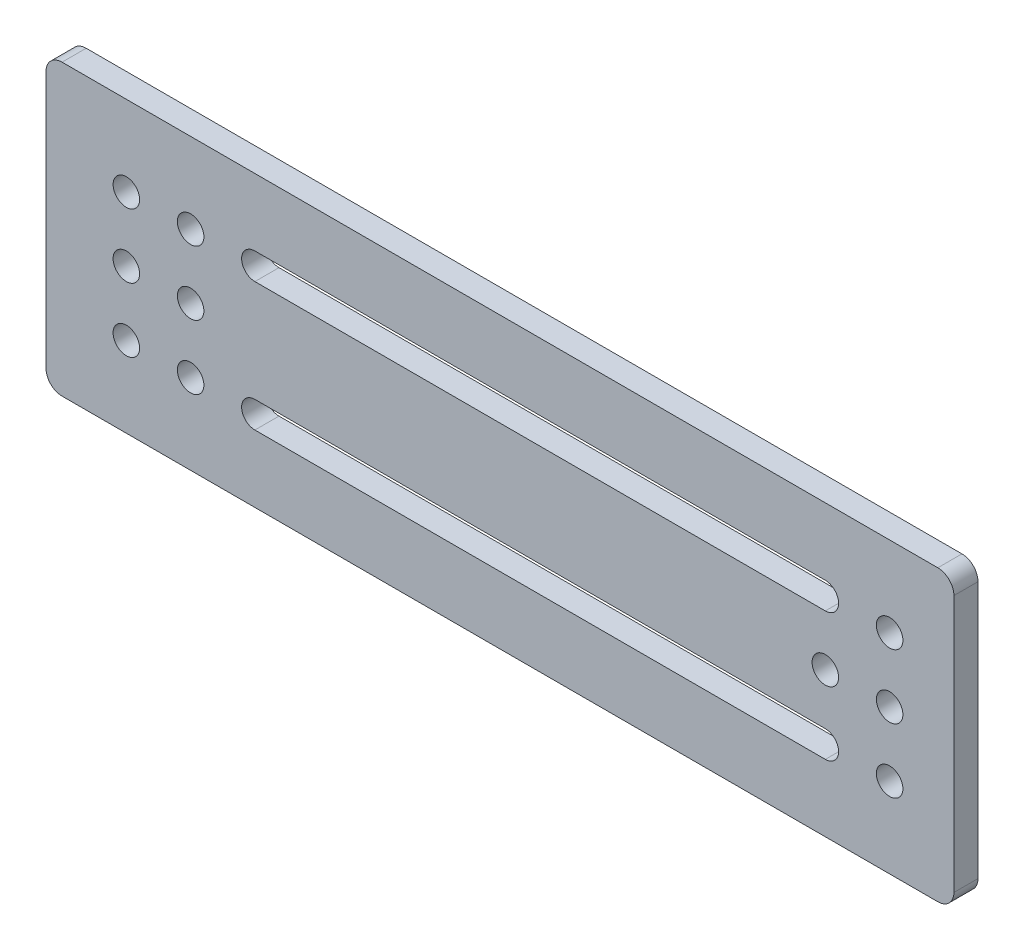
ISO-10303-21;
HEADER;
FILE_DESCRIPTION(('STEP AP214'),'2;1');
FILE_NAME('part.step','',(''),(''),'','','');
FILE_SCHEMA(('AUTOMOTIVE_DESIGN { 1 0 10303 214 1 1 1 1 }'));
ENDSEC;
DATA;
#1=APPLICATION_CONTEXT('core data for automotive mechanical design processes');
#2=APPLICATION_PROTOCOL_DEFINITION('international standard','automotive_design',2000,#1);
#3=PRODUCT_CONTEXT('',#1,'mechanical');
#4=PRODUCT('Part','Part','',(#3));
#5=PRODUCT_RELATED_PRODUCT_CATEGORY('part','',(#4));
#6=PRODUCT_DEFINITION_FORMATION('','',#4);
#7=PRODUCT_DEFINITION_CONTEXT('part definition',#1,'design');
#8=PRODUCT_DEFINITION('design','',#6,#7);
#9=PRODUCT_DEFINITION_SHAPE('','',#8);
#10=(LENGTH_UNIT() NAMED_UNIT(*) SI_UNIT(.MILLI.,.METRE.));
#11=(NAMED_UNIT(*) PLANE_ANGLE_UNIT() SI_UNIT($,.RADIAN.));
#12=(NAMED_UNIT(*) SI_UNIT($,.STERADIAN.) SOLID_ANGLE_UNIT());
#13=UNCERTAINTY_MEASURE_WITH_UNIT(LENGTH_MEASURE(1.E-05),#10,'distance_accuracy_value','');
#14=(GEOMETRIC_REPRESENTATION_CONTEXT(3) GLOBAL_UNCERTAINTY_ASSIGNED_CONTEXT((#13)) GLOBAL_UNIT_ASSIGNED_CONTEXT((#10,
#11,#12)) REPRESENTATION_CONTEXT('',''));
#15=CARTESIAN_POINT('',(0.,0.,0.));
#16=DIRECTION('',(0.,0.,1.));
#17=DIRECTION('',(1.,0.,0.));
#18=AXIS2_PLACEMENT_3D('',#15,#16,#17);
#19=CARTESIAN_POINT('',(0.,0.,3.));
#20=DIRECTION('',(0.,1.,0.));
#21=DIRECTION('',(0.,0.,1.));
#22=AXIS2_PLACEMENT_3D('',#19,#20,#21);
#23=PLANE('',#22);
#24=DIRECTION('',(1.,0.,0.));
#25=VECTOR('',#24,1.);
#26=CARTESIAN_POINT('',(0.,0.,3.));
#27=LINE('',#26,#25);
#28=CARTESIAN_POINT('',(2.,0.,3.));
#29=VERTEX_POINT('',#28);
#30=CARTESIAN_POINT('',(111.,0.,3.));
#31=VERTEX_POINT('',#30);
#32=EDGE_CURVE('E203',#29,#31,#27,.T.);
#33=ORIENTED_EDGE('',*,*,#32,.F.);
#34=DIRECTION('',(0.,0.,-1.));
#35=VECTOR('',#34,1.);
#36=CARTESIAN_POINT('',(2.,0.,0.));
#37=LINE('',#36,#35);
#38=CARTESIAN_POINT('',(2.,0.,0.));
#39=VERTEX_POINT('',#38);
#40=EDGE_CURVE('E309',#29,#39,#37,.T.);
#41=ORIENTED_EDGE('',*,*,#40,.T.);
#42=DIRECTION('',(1.,0.,0.));
#43=VECTOR('',#42,1.);
#44=CARTESIAN_POINT('',(0.,0.,0.));
#45=LINE('',#44,#43);
#46=CARTESIAN_POINT('',(111.,0.,0.));
#47=VERTEX_POINT('',#46);
#48=EDGE_CURVE('E264',#39,#47,#45,.T.);
#49=ORIENTED_EDGE('',*,*,#48,.T.);
#50=DIRECTION('',(0.,0.,-1.));
#51=VECTOR('',#50,1.);
#52=CARTESIAN_POINT('',(111.,0.,3.));
#53=LINE('',#52,#51);
#54=EDGE_CURVE('E302',#47,#31,#53,.F.);
#55=ORIENTED_EDGE('',*,*,#54,.T.);
#56=EDGE_LOOP('',(#33,#41,#49,#55));
#57=FACE_BOUND('',#56,.T.);
#58=ADVANCED_FACE('F36',(#57),#23,.F.);
#59=CARTESIAN_POINT('',(113.,0.,3.));
#60=DIRECTION('',(-1.,0.,0.));
#61=DIRECTION('',(0.,0.,1.));
#62=AXIS2_PLACEMENT_3D('',#59,#60,#61);
#63=PLANE('',#62);
#64=DIRECTION('',(0.,1.,0.));
#65=VECTOR('',#64,1.);
#66=CARTESIAN_POINT('',(113.,0.,3.));
#67=LINE('',#66,#65);
#68=CARTESIAN_POINT('',(113.,2.,3.));
#69=VERTEX_POINT('',#68);
#70=CARTESIAN_POINT('',(113.,34.,3.));
#71=VERTEX_POINT('',#70);
#72=EDGE_CURVE('E206',#69,#71,#67,.T.);
#73=ORIENTED_EDGE('',*,*,#72,.F.);
#74=DIRECTION('',(0.,0.,-1.));
#75=VECTOR('',#74,1.);
#76=CARTESIAN_POINT('',(113.,2.,3.));
#77=LINE('',#76,#75);
#78=CARTESIAN_POINT('',(113.,2.,0.));
#79=VERTEX_POINT('',#78);
#80=EDGE_CURVE('E334',#69,#79,#77,.T.);
#81=ORIENTED_EDGE('',*,*,#80,.T.);
#82=DIRECTION('',(0.,1.,0.));
#83=VECTOR('',#82,1.);
#84=CARTESIAN_POINT('',(113.,0.,0.));
#85=LINE('',#84,#83);
#86=CARTESIAN_POINT('',(113.,34.,0.));
#87=VERTEX_POINT('',#86);
#88=EDGE_CURVE('E267',#79,#87,#85,.T.);
#89=ORIENTED_EDGE('',*,*,#88,.T.);
#90=DIRECTION('',(0.,0.,-1.));
#91=VECTOR('',#90,1.);
#92=CARTESIAN_POINT('',(113.,34.,3.));
#93=LINE('',#92,#91);
#94=EDGE_CURVE('E332',#87,#71,#93,.F.);
#95=ORIENTED_EDGE('',*,*,#94,.T.);
#96=EDGE_LOOP('',(#73,#81,#89,#95));
#97=FACE_BOUND('',#96,.T.);
#98=ADVANCED_FACE('F340',(#97),#63,.F.);
#99=CARTESIAN_POINT('',(0.,36.,3.));
#100=DIRECTION('',(0.,1.,0.));
#101=DIRECTION('',(0.,0.,1.));
#102=AXIS2_PLACEMENT_3D('',#99,#100,#101);
#103=PLANE('',#102);
#104=DIRECTION('',(1.,0.,0.));
#105=VECTOR('',#104,1.);
#106=CARTESIAN_POINT('',(0.,36.,3.));
#107=LINE('',#106,#105);
#108=CARTESIAN_POINT('',(2.,36.,3.));
#109=VERTEX_POINT('',#108);
#110=CARTESIAN_POINT('',(111.,36.,3.));
#111=VERTEX_POINT('',#110);
#112=EDGE_CURVE('E208',#109,#111,#107,.T.);
#113=ORIENTED_EDGE('',*,*,#112,.T.);
#114=DIRECTION('',(0.,0.,-1.));
#115=VECTOR('',#114,1.);
#116=CARTESIAN_POINT('',(111.,36.,0.));
#117=LINE('',#116,#115);
#118=CARTESIAN_POINT('',(111.,36.,0.));
#119=VERTEX_POINT('',#118);
#120=EDGE_CURVE('E11',#111,#119,#117,.T.);
#121=ORIENTED_EDGE('',*,*,#120,.T.);
#122=DIRECTION('',(1.,0.,0.));
#123=VECTOR('',#122,1.);
#124=CARTESIAN_POINT('',(0.,36.,0.));
#125=LINE('',#124,#123);
#126=CARTESIAN_POINT('',(2.,36.,0.));
#127=VERTEX_POINT('',#126);
#128=EDGE_CURVE('E270',#127,#119,#125,.T.);
#129=ORIENTED_EDGE('',*,*,#128,.F.);
#130=DIRECTION('',(0.,0.,-1.));
#131=VECTOR('',#130,1.);
#132=CARTESIAN_POINT('',(2.,36.,3.));
#133=LINE('',#132,#131);
#134=EDGE_CURVE('E44',#127,#109,#133,.F.);
#135=ORIENTED_EDGE('',*,*,#134,.T.);
#136=EDGE_LOOP('',(#113,#121,#129,#135));
#137=FACE_BOUND('',#136,.T.);
#138=ADVANCED_FACE('F351',(#137),#103,.T.);
#139=CARTESIAN_POINT('',(26.,10.,3.));
#140=DIRECTION('',(0.,0.,-1.));
#141=DIRECTION('',(-1.,0.,0.));
#142=AXIS2_PLACEMENT_3D('',#139,#140,#141);
#143=CYLINDRICAL_SURFACE('',#142,1.65);
#144=CARTESIAN_POINT('',(26.,10.,0.));
#145=DIRECTION('',(0.,0.,1.));
#146=DIRECTION('',(1.,0.,0.));
#147=AXIS2_PLACEMENT_3D('',#144,#145,#146);
#148=CIRCLE('',#147,1.65);
#149=CARTESIAN_POINT('',(26.,11.65,0.));
#150=VERTEX_POINT('',#149);
#151=CARTESIAN_POINT('',(26.,8.35,0.));
#152=VERTEX_POINT('',#151);
#153=EDGE_CURVE('E243',#150,#152,#148,.T.);
#154=ORIENTED_EDGE('',*,*,#153,.F.);
#155=DIRECTION('',(0.,0.,-1.));
#156=VECTOR('',#155,1.);
#157=CARTESIAN_POINT('',(26.,11.65,3.));
#158=LINE('',#157,#156);
#159=CARTESIAN_POINT('',(26.,11.65,3.));
#160=VERTEX_POINT('',#159);
#161=EDGE_CURVE('E300',#160,#150,#158,.T.);
#162=ORIENTED_EDGE('',*,*,#161,.F.);
#163=CARTESIAN_POINT('',(26.,10.,3.));
#164=DIRECTION('',(0.,0.,1.));
#165=DIRECTION('',(1.,0.,0.));
#166=AXIS2_PLACEMENT_3D('',#163,#164,#165);
#167=CIRCLE('',#166,1.65);
#168=CARTESIAN_POINT('',(26.,8.35,3.));
#169=VERTEX_POINT('',#168);
#170=EDGE_CURVE('E183',#160,#169,#167,.T.);
#171=ORIENTED_EDGE('',*,*,#170,.T.);
#172=DIRECTION('',(0.,0.,-1.));
#173=VECTOR('',#172,1.);
#174=CARTESIAN_POINT('',(26.,8.35,3.));
#175=LINE('',#174,#173);
#176=EDGE_CURVE('E159',#169,#152,#175,.T.);
#177=ORIENTED_EDGE('',*,*,#176,.T.);
#178=EDGE_LOOP('',(#154,#162,#171,#177));
#179=FACE_BOUND('',#178,.T.);
#180=ADVANCED_FACE('F408',(#179),#143,.F.);
#181=CARTESIAN_POINT('',(0.,11.65,3.));
#182=DIRECTION('',(0.,1.,0.));
#183=DIRECTION('',(-1.,0.,0.));
#184=AXIS2_PLACEMENT_3D('',#181,#182,#183);
#185=PLANE('',#184);
#186=DIRECTION('',(1.,0.,0.));
#187=VECTOR('',#186,1.);
#188=CARTESIAN_POINT('',(0.,11.65,0.));
#189=LINE('',#188,#187);
#190=CARTESIAN_POINT('',(97.,11.65,0.));
#191=VERTEX_POINT('',#190);
#192=EDGE_CURVE('E246',#150,#191,#189,.T.);
#193=ORIENTED_EDGE('',*,*,#192,.T.);
#194=DIRECTION('',(0.,0.,-1.));
#195=VECTOR('',#194,1.);
#196=CARTESIAN_POINT('',(97.,11.65,3.));
#197=LINE('',#196,#195);
#198=CARTESIAN_POINT('',(97.,11.65,3.));
#199=VERTEX_POINT('',#198);
#200=EDGE_CURVE('E297',#199,#191,#197,.T.);
#201=ORIENTED_EDGE('',*,*,#200,.F.);
#202=DIRECTION('',(1.,0.,0.));
#203=VECTOR('',#202,1.);
#204=CARTESIAN_POINT('',(0.,11.65,3.));
#205=LINE('',#204,#203);
#206=EDGE_CURVE('E186',#160,#199,#205,.T.);
#207=ORIENTED_EDGE('',*,*,#206,.F.);
#208=ORIENTED_EDGE('',*,*,#161,.T.);
#209=EDGE_LOOP('',(#193,#201,#207,#208));
#210=FACE_BOUND('',#209,.T.);
#211=ADVANCED_FACE('F404',(#210),#185,.F.);
#212=CARTESIAN_POINT('',(97.,10.,3.));
#213=DIRECTION('',(0.,0.,-1.));
#214=DIRECTION('',(-1.,0.,0.));
#215=AXIS2_PLACEMENT_3D('',#212,#213,#214);
#216=CYLINDRICAL_SURFACE('',#215,1.65);
#217=CARTESIAN_POINT('',(97.,10.,0.));
#218=DIRECTION('',(0.,0.,1.));
#219=DIRECTION('',(1.,0.,0.));
#220=AXIS2_PLACEMENT_3D('',#217,#218,#219);
#221=CIRCLE('',#220,1.65);
#222=CARTESIAN_POINT('',(97.,8.35,0.));
#223=VERTEX_POINT('',#222);
#224=EDGE_CURVE('E249',#191,#223,#221,.F.);
#225=ORIENTED_EDGE('',*,*,#224,.T.);
#226=DIRECTION('',(0.,0.,-1.));
#227=VECTOR('',#226,1.);
#228=CARTESIAN_POINT('',(97.,8.35,3.));
#229=LINE('',#228,#227);
#230=CARTESIAN_POINT('',(97.,8.35,3.));
#231=VERTEX_POINT('',#230);
#232=EDGE_CURVE('E294',#231,#223,#229,.T.);
#233=ORIENTED_EDGE('',*,*,#232,.F.);
#234=CARTESIAN_POINT('',(97.,10.,3.));
#235=DIRECTION('',(0.,0.,1.));
#236=DIRECTION('',(1.,0.,0.));
#237=AXIS2_PLACEMENT_3D('',#234,#235,#236);
#238=CIRCLE('',#237,1.65);
#239=EDGE_CURVE('E189',#199,#231,#238,.F.);
#240=ORIENTED_EDGE('',*,*,#239,.F.);
#241=ORIENTED_EDGE('',*,*,#200,.T.);
#242=EDGE_LOOP('',(#225,#233,#240,#241));
#243=FACE_BOUND('',#242,.T.);
#244=ADVANCED_FACE('F401',(#243),#216,.F.);
#245=CARTESIAN_POINT('',(26.,26.,3.));
#246=DIRECTION('',(0.,0.,-1.));
#247=DIRECTION('',(-1.,0.,0.));
#248=AXIS2_PLACEMENT_3D('',#245,#246,#247);
#249=CYLINDRICAL_SURFACE('',#248,1.65);
#250=CARTESIAN_POINT('',(26.,26.,0.));
#251=DIRECTION('',(0.,0.,1.));
#252=DIRECTION('',(1.,0.,0.));
#253=AXIS2_PLACEMENT_3D('',#250,#251,#252);
#254=CIRCLE('',#253,1.65);
#255=CARTESIAN_POINT('',(26.,27.65,0.));
#256=VERTEX_POINT('',#255);
#257=CARTESIAN_POINT('',(26.,24.35,0.));
#258=VERTEX_POINT('',#257);
#259=EDGE_CURVE('E156',#256,#258,#254,.T.);
#260=ORIENTED_EDGE('',*,*,#259,.F.);
#261=DIRECTION('',(0.,0.,-1.));
#262=VECTOR('',#261,1.);
#263=CARTESIAN_POINT('',(26.,27.65,3.));
#264=LINE('',#263,#262);
#265=CARTESIAN_POINT('',(26.,27.65,3.));
#266=VERTEX_POINT('',#265);
#267=EDGE_CURVE('E150',#266,#256,#264,.T.);
#268=ORIENTED_EDGE('',*,*,#267,.F.);
#269=CARTESIAN_POINT('',(26.,26.,3.));
#270=DIRECTION('',(0.,0.,1.));
#271=DIRECTION('',(1.,0.,0.));
#272=AXIS2_PLACEMENT_3D('',#269,#270,#271);
#273=CIRCLE('',#272,1.65);
#274=CARTESIAN_POINT('',(26.,24.35,3.));
#275=VERTEX_POINT('',#274);
#276=EDGE_CURVE('E154',#266,#275,#273,.T.);
#277=ORIENTED_EDGE('',*,*,#276,.T.);
#278=DIRECTION('',(0.,0.,-1.));
#279=VECTOR('',#278,1.);
#280=CARTESIAN_POINT('',(26.,24.35,3.));
#281=LINE('',#280,#279);
#282=EDGE_CURVE('E234',#275,#258,#281,.T.);
#283=ORIENTED_EDGE('',*,*,#282,.T.);
#284=EDGE_LOOP('',(#260,#268,#277,#283));
#285=FACE_BOUND('',#284,.T.);
#286=ADVANCED_FACE('F152',(#285),#249,.F.);
#287=CARTESIAN_POINT('',(0.,27.65,3.));
#288=DIRECTION('',(0.,1.,0.));
#289=DIRECTION('',(-1.,0.,0.));
#290=AXIS2_PLACEMENT_3D('',#287,#288,#289);
#291=PLANE('',#290);
#292=DIRECTION('',(1.,0.,0.));
#293=VECTOR('',#292,1.);
#294=CARTESIAN_POINT('',(0.,27.65,0.));
#295=LINE('',#294,#293);
#296=CARTESIAN_POINT('',(97.,27.65,0.));
#297=VERTEX_POINT('',#296);
#298=EDGE_CURVE('E236',#256,#297,#295,.T.);
#299=ORIENTED_EDGE('',*,*,#298,.T.);
#300=DIRECTION('',(0.,0.,-1.));
#301=VECTOR('',#300,1.);
#302=CARTESIAN_POINT('',(97.,27.65,3.));
#303=LINE('',#302,#301);
#304=CARTESIAN_POINT('',(97.,27.65,3.));
#305=VERTEX_POINT('',#304);
#306=EDGE_CURVE('E160',#305,#297,#303,.T.);
#307=ORIENTED_EDGE('',*,*,#306,.F.);
#308=DIRECTION('',(1.,0.,0.));
#309=VECTOR('',#308,1.);
#310=CARTESIAN_POINT('',(0.,27.65,3.));
#311=LINE('',#310,#309);
#312=EDGE_CURVE('E163',#266,#305,#311,.T.);
#313=ORIENTED_EDGE('',*,*,#312,.F.);
#314=ORIENTED_EDGE('',*,*,#267,.T.);
#315=EDGE_LOOP('',(#299,#307,#313,#314));
#316=FACE_BOUND('',#315,.T.);
#317=ADVANCED_FACE('F164',(#316),#291,.F.);
#318=CARTESIAN_POINT('',(97.,26.,3.));
#319=DIRECTION('',(0.,0.,-1.));
#320=DIRECTION('',(-1.,0.,0.));
#321=AXIS2_PLACEMENT_3D('',#318,#319,#320);
#322=CYLINDRICAL_SURFACE('',#321,1.65);
#323=CARTESIAN_POINT('',(97.,26.,0.));
#324=DIRECTION('',(0.,0.,1.));
#325=DIRECTION('',(1.,0.,0.));
#326=AXIS2_PLACEMENT_3D('',#323,#324,#325);
#327=CIRCLE('',#326,1.65);
#328=CARTESIAN_POINT('',(97.,24.35,0.));
#329=VERTEX_POINT('',#328);
#330=EDGE_CURVE('E238',#297,#329,#327,.F.);
#331=ORIENTED_EDGE('',*,*,#330,.T.);
#332=DIRECTION('',(0.,0.,-1.));
#333=VECTOR('',#332,1.);
#334=CARTESIAN_POINT('',(97.,24.35,3.));
#335=LINE('',#334,#333);
#336=CARTESIAN_POINT('',(97.,24.35,3.));
#337=VERTEX_POINT('',#336);
#338=EDGE_CURVE('E304',#337,#329,#335,.T.);
#339=ORIENTED_EDGE('',*,*,#338,.F.);
#340=CARTESIAN_POINT('',(97.,26.,3.));
#341=DIRECTION('',(0.,0.,1.));
#342=DIRECTION('',(1.,0.,0.));
#343=AXIS2_PLACEMENT_3D('',#340,#341,#342);
#344=CIRCLE('',#343,1.65);
#345=EDGE_CURVE('E168',#305,#337,#344,.F.);
#346=ORIENTED_EDGE('',*,*,#345,.F.);
#347=ORIENTED_EDGE('',*,*,#306,.T.);
#348=EDGE_LOOP('',(#331,#339,#346,#347));
#349=FACE_BOUND('',#348,.T.);
#350=ADVANCED_FACE('F417',(#349),#322,.F.);
#351=CARTESIAN_POINT('',(105.,26.,3.));
#352=DIRECTION('',(0.,0.,-1.));
#353=DIRECTION('',(-1.,0.,0.));
#354=AXIS2_PLACEMENT_3D('',#351,#352,#353);
#355=CYLINDRICAL_SURFACE('',#354,1.65);
#356=CARTESIAN_POINT('',(105.,26.,3.));
#357=DIRECTION('',(0.,0.,1.));
#358=DIRECTION('',(1.,0.,0.));
#359=AXIS2_PLACEMENT_3D('',#356,#357,#358);
#360=CIRCLE('',#359,1.65);
#361=CARTESIAN_POINT('',(106.65,26.,3.));
#362=VERTEX_POINT('',#361);
#363=EDGE_CURVE('E228',#362,#362,#360,.T.);
#364=ORIENTED_EDGE('',*,*,#363,.T.);
#365=EDGE_LOOP('',(#364));
#366=FACE_BOUND('',#365,.T.);
#367=CARTESIAN_POINT('',(105.,26.,0.));
#368=DIRECTION('',(0.,0.,1.));
#369=DIRECTION('',(1.,0.,0.));
#370=AXIS2_PLACEMENT_3D('',#367,#368,#369);
#371=CIRCLE('',#370,1.65);
#372=CARTESIAN_POINT('',(106.65,26.,0.));
#373=VERTEX_POINT('',#372);
#374=EDGE_CURVE('E178',#373,#373,#371,.T.);
#375=ORIENTED_EDGE('',*,*,#374,.F.);
#376=EDGE_LOOP('',(#375));
#377=FACE_BOUND('',#376,.T.);
#378=ADVANCED_FACE('F420',(#366,#377),#355,.F.);
#379=CARTESIAN_POINT('',(105.,10.,3.));
#380=DIRECTION('',(0.,0.,-1.));
#381=DIRECTION('',(-1.,0.,0.));
#382=AXIS2_PLACEMENT_3D('',#379,#380,#381);
#383=CYLINDRICAL_SURFACE('',#382,1.65);
#384=CARTESIAN_POINT('',(105.,10.,3.));
#385=DIRECTION('',(0.,0.,1.));
#386=DIRECTION('',(1.,0.,0.));
#387=AXIS2_PLACEMENT_3D('',#384,#385,#386);
#388=CIRCLE('',#387,1.65);
#389=CARTESIAN_POINT('',(106.65,10.,3.));
#390=VERTEX_POINT('',#389);
#391=EDGE_CURVE('E225',#390,#390,#388,.T.);
#392=ORIENTED_EDGE('',*,*,#391,.T.);
#393=EDGE_LOOP('',(#392));
#394=FACE_BOUND('',#393,.T.);
#395=CARTESIAN_POINT('',(105.,10.,0.));
#396=DIRECTION('',(0.,0.,1.));
#397=DIRECTION('',(1.,0.,0.));
#398=AXIS2_PLACEMENT_3D('',#395,#396,#397);
#399=CIRCLE('',#398,1.65);
#400=CARTESIAN_POINT('',(106.65,10.,0.));
#401=VERTEX_POINT('',#400);
#402=EDGE_CURVE('E288',#401,#401,#399,.T.);
#403=ORIENTED_EDGE('',*,*,#402,.F.);
#404=EDGE_LOOP('',(#403));
#405=FACE_BOUND('',#404,.T.);
#406=ADVANCED_FACE('F443',(#394,#405),#383,.F.);
#407=CARTESIAN_POINT('',(105.,18.,3.));
#408=DIRECTION('',(0.,0.,-1.));
#409=DIRECTION('',(-1.,0.,0.));
#410=AXIS2_PLACEMENT_3D('',#407,#408,#409);
#411=CYLINDRICAL_SURFACE('',#410,1.65);
#412=CARTESIAN_POINT('',(105.,18.,3.));
#413=DIRECTION('',(0.,0.,1.));
#414=DIRECTION('',(1.,0.,0.));
#415=AXIS2_PLACEMENT_3D('',#412,#413,#414);
#416=CIRCLE('',#415,1.65);
#417=CARTESIAN_POINT('',(106.65,18.,3.));
#418=VERTEX_POINT('',#417);
#419=EDGE_CURVE('E222',#418,#418,#416,.T.);
#420=ORIENTED_EDGE('',*,*,#419,.T.);
#421=EDGE_LOOP('',(#420));
#422=FACE_BOUND('',#421,.T.);
#423=CARTESIAN_POINT('',(105.,18.,0.));
#424=DIRECTION('',(0.,0.,1.));
#425=DIRECTION('',(1.,0.,0.));
#426=AXIS2_PLACEMENT_3D('',#423,#424,#425);
#427=CIRCLE('',#426,1.65);
#428=CARTESIAN_POINT('',(106.65,18.,0.));
#429=VERTEX_POINT('',#428);
#430=EDGE_CURVE('E285',#429,#429,#427,.T.);
#431=ORIENTED_EDGE('',*,*,#430,.F.);
#432=EDGE_LOOP('',(#431));
#433=FACE_BOUND('',#432,.T.);
#434=ADVANCED_FACE('F451',(#422,#433),#411,.F.);
#435=CARTESIAN_POINT('',(10.,18.,3.));
#436=DIRECTION('',(0.,0.,-1.));
#437=DIRECTION('',(-1.,0.,0.));
#438=AXIS2_PLACEMENT_3D('',#435,#436,#437);
#439=CYLINDRICAL_SURFACE('',#438,1.65);
#440=CARTESIAN_POINT('',(10.,18.,3.));
#441=DIRECTION('',(0.,0.,1.));
#442=DIRECTION('',(1.,0.,0.));
#443=AXIS2_PLACEMENT_3D('',#440,#441,#442);
#444=CIRCLE('',#443,1.65);
#445=CARTESIAN_POINT('',(11.65,18.,3.));
#446=VERTEX_POINT('',#445);
#447=EDGE_CURVE('E219',#446,#446,#444,.T.);
#448=ORIENTED_EDGE('',*,*,#447,.T.);
#449=EDGE_LOOP('',(#448));
#450=FACE_BOUND('',#449,.T.);
#451=CARTESIAN_POINT('',(10.,18.,0.));
#452=DIRECTION('',(0.,0.,1.));
#453=DIRECTION('',(1.,0.,0.));
#454=AXIS2_PLACEMENT_3D('',#451,#452,#453);
#455=CIRCLE('',#454,1.65);
#456=CARTESIAN_POINT('',(11.65,18.,0.));
#457=VERTEX_POINT('',#456);
#458=EDGE_CURVE('E282',#457,#457,#455,.T.);
#459=ORIENTED_EDGE('',*,*,#458,.F.);
#460=EDGE_LOOP('',(#459));
#461=FACE_BOUND('',#460,.T.);
#462=ADVANCED_FACE('F459',(#450,#461),#439,.F.);
#463=CARTESIAN_POINT('',(10.,10.,3.));
#464=DIRECTION('',(0.,0.,-1.));
#465=DIRECTION('',(-1.,0.,0.));
#466=AXIS2_PLACEMENT_3D('',#463,#464,#465);
#467=CYLINDRICAL_SURFACE('',#466,1.65);
#468=CARTESIAN_POINT('',(10.,10.,3.));
#469=DIRECTION('',(0.,0.,1.));
#470=DIRECTION('',(1.,0.,0.));
#471=AXIS2_PLACEMENT_3D('',#468,#469,#470);
#472=CIRCLE('',#471,1.65);
#473=CARTESIAN_POINT('',(11.65,10.,3.));
#474=VERTEX_POINT('',#473);
#475=EDGE_CURVE('E216',#474,#474,#472,.T.);
#476=ORIENTED_EDGE('',*,*,#475,.T.);
#477=EDGE_LOOP('',(#476));
#478=FACE_BOUND('',#477,.T.);
#479=CARTESIAN_POINT('',(10.,10.,0.));
#480=DIRECTION('',(0.,0.,1.));
#481=DIRECTION('',(1.,0.,0.));
#482=AXIS2_PLACEMENT_3D('',#479,#480,#481);
#483=CIRCLE('',#482,1.65);
#484=CARTESIAN_POINT('',(11.65,10.,0.));
#485=VERTEX_POINT('',#484);
#486=EDGE_CURVE('E279',#485,#485,#483,.T.);
#487=ORIENTED_EDGE('',*,*,#486,.F.);
#488=EDGE_LOOP('',(#487));
#489=FACE_BOUND('',#488,.T.);
#490=ADVANCED_FACE('F467',(#478,#489),#467,.F.);
#491=CARTESIAN_POINT('',(10.,26.,3.));
#492=DIRECTION('',(0.,0.,-1.));
#493=DIRECTION('',(-1.,0.,0.));
#494=AXIS2_PLACEMENT_3D('',#491,#492,#493);
#495=CYLINDRICAL_SURFACE('',#494,1.65);
#496=CARTESIAN_POINT('',(10.,26.,3.));
#497=DIRECTION('',(0.,0.,1.));
#498=DIRECTION('',(1.,0.,0.));
#499=AXIS2_PLACEMENT_3D('',#496,#497,#498);
#500=CIRCLE('',#499,1.65);
#501=CARTESIAN_POINT('',(11.65,26.,3.));
#502=VERTEX_POINT('',#501);
#503=EDGE_CURVE('E213',#502,#502,#500,.T.);
#504=ORIENTED_EDGE('',*,*,#503,.T.);
#505=EDGE_LOOP('',(#504));
#506=FACE_BOUND('',#505,.T.);
#507=CARTESIAN_POINT('',(10.,26.,0.));
#508=DIRECTION('',(0.,0.,1.));
#509=DIRECTION('',(1.,0.,0.));
#510=AXIS2_PLACEMENT_3D('',#507,#508,#509);
#511=CIRCLE('',#510,1.65);
#512=CARTESIAN_POINT('',(11.65,26.,0.));
#513=VERTEX_POINT('',#512);
#514=EDGE_CURVE('E276',#513,#513,#511,.T.);
#515=ORIENTED_EDGE('',*,*,#514,.F.);
#516=EDGE_LOOP('',(#515));
#517=FACE_BOUND('',#516,.T.);
#518=ADVANCED_FACE('F475',(#506,#517),#495,.F.);
#519=CARTESIAN_POINT('',(0.,0.,3.));
#520=DIRECTION('',(-1.,0.,0.));
#521=DIRECTION('',(0.,0.,1.));
#522=AXIS2_PLACEMENT_3D('',#519,#520,#521);
#523=PLANE('',#522);
#524=DIRECTION('',(0.,1.,0.));
#525=VECTOR('',#524,1.);
#526=CARTESIAN_POINT('',(0.,0.,0.));
#527=LINE('',#526,#525);
#528=CARTESIAN_POINT('',(0.,2.,0.));
#529=VERTEX_POINT('',#528);
#530=CARTESIAN_POINT('',(0.,34.,0.));
#531=VERTEX_POINT('',#530);
#532=EDGE_CURVE('E273',#529,#531,#527,.T.);
#533=ORIENTED_EDGE('',*,*,#532,.F.);
#534=DIRECTION('',(0.,0.,-1.));
#535=VECTOR('',#534,1.);
#536=CARTESIAN_POINT('',(0.,2.,3.));
#537=LINE('',#536,#535);
#538=CARTESIAN_POINT('',(0.,2.,3.));
#539=VERTEX_POINT('',#538);
#540=EDGE_CURVE('E323',#529,#539,#537,.F.);
#541=ORIENTED_EDGE('',*,*,#540,.T.);
#542=DIRECTION('',(0.,1.,0.));
#543=VECTOR('',#542,1.);
#544=CARTESIAN_POINT('',(0.,0.,3.));
#545=LINE('',#544,#543);
#546=CARTESIAN_POINT('',(0.,34.,3.));
#547=VERTEX_POINT('',#546);
#548=EDGE_CURVE('E210',#539,#547,#545,.T.);
#549=ORIENTED_EDGE('',*,*,#548,.T.);
#550=DIRECTION('',(0.,0.,-1.));
#551=VECTOR('',#550,1.);
#552=CARTESIAN_POINT('',(0.,34.,3.));
#553=LINE('',#552,#551);
#554=EDGE_CURVE('E320',#547,#531,#553,.T.);
#555=ORIENTED_EDGE('',*,*,#554,.T.);
#556=EDGE_LOOP('',(#533,#541,#549,#555));
#557=FACE_BOUND('',#556,.T.);
#558=ADVANCED_FACE('F359',(#557),#523,.T.);
#559=CARTESIAN_POINT('',(18.,18.,3.));
#560=DIRECTION('',(0.,0.,-1.));
#561=DIRECTION('',(-1.,0.,0.));
#562=AXIS2_PLACEMENT_3D('',#559,#560,#561);
#563=CYLINDRICAL_SURFACE('',#562,1.65);
#564=CARTESIAN_POINT('',(18.,18.,3.));
#565=DIRECTION('',(0.,0.,1.));
#566=DIRECTION('',(1.,0.,0.));
#567=AXIS2_PLACEMENT_3D('',#564,#565,#566);
#568=CIRCLE('',#567,1.65);
#569=CARTESIAN_POINT('',(19.65,18.,3.));
#570=VERTEX_POINT('',#569);
#571=EDGE_CURVE('E200',#570,#570,#568,.T.);
#572=ORIENTED_EDGE('',*,*,#571,.T.);
#573=EDGE_LOOP('',(#572));
#574=FACE_BOUND('',#573,.T.);
#575=CARTESIAN_POINT('',(18.,18.,0.));
#576=DIRECTION('',(0.,0.,1.));
#577=DIRECTION('',(1.,0.,0.));
#578=AXIS2_PLACEMENT_3D('',#575,#576,#577);
#579=CIRCLE('',#578,1.65);
#580=CARTESIAN_POINT('',(19.65,18.,0.));
#581=VERTEX_POINT('',#580);
#582=EDGE_CURVE('E261',#581,#581,#579,.T.);
#583=ORIENTED_EDGE('',*,*,#582,.F.);
#584=EDGE_LOOP('',(#583));
#585=FACE_BOUND('',#584,.T.);
#586=ADVANCED_FACE('F384',(#574,#585),#563,.F.);
#587=CARTESIAN_POINT('',(18.,26.,3.));
#588=DIRECTION('',(0.,0.,-1.));
#589=DIRECTION('',(-1.,0.,0.));
#590=AXIS2_PLACEMENT_3D('',#587,#588,#589);
#591=CYLINDRICAL_SURFACE('',#590,1.65);
#592=CARTESIAN_POINT('',(18.,26.,3.));
#593=DIRECTION('',(0.,0.,1.));
#594=DIRECTION('',(1.,0.,0.));
#595=AXIS2_PLACEMENT_3D('',#592,#593,#594);
#596=CIRCLE('',#595,1.65);
#597=CARTESIAN_POINT('',(19.65,26.,3.));
#598=VERTEX_POINT('',#597);
#599=EDGE_CURVE('E197',#598,#598,#596,.T.);
#600=ORIENTED_EDGE('',*,*,#599,.T.);
#601=EDGE_LOOP('',(#600));
#602=FACE_BOUND('',#601,.T.);
#603=CARTESIAN_POINT('',(18.,26.,0.));
#604=DIRECTION('',(0.,0.,1.));
#605=DIRECTION('',(1.,0.,0.));
#606=AXIS2_PLACEMENT_3D('',#603,#604,#605);
#607=CIRCLE('',#606,1.65);
#608=CARTESIAN_POINT('',(19.65,26.,0.));
#609=VERTEX_POINT('',#608);
#610=EDGE_CURVE('E258',#609,#609,#607,.T.);
#611=ORIENTED_EDGE('',*,*,#610,.F.);
#612=EDGE_LOOP('',(#611));
#613=FACE_BOUND('',#612,.T.);
#614=ADVANCED_FACE('F387',(#602,#613),#591,.F.);
#615=CARTESIAN_POINT('',(18.,10.,3.));
#616=DIRECTION('',(0.,0.,-1.));
#617=DIRECTION('',(-1.,0.,0.));
#618=AXIS2_PLACEMENT_3D('',#615,#616,#617);
#619=CYLINDRICAL_SURFACE('',#618,1.65);
#620=CARTESIAN_POINT('',(18.,10.,3.));
#621=DIRECTION('',(0.,0.,1.));
#622=DIRECTION('',(1.,0.,0.));
#623=AXIS2_PLACEMENT_3D('',#620,#621,#622);
#624=CIRCLE('',#623,1.65);
#625=CARTESIAN_POINT('',(19.65,10.,3.));
#626=VERTEX_POINT('',#625);
#627=EDGE_CURVE('E194',#626,#626,#624,.T.);
#628=ORIENTED_EDGE('',*,*,#627,.T.);
#629=EDGE_LOOP('',(#628));
#630=FACE_BOUND('',#629,.T.);
#631=CARTESIAN_POINT('',(18.,10.,0.));
#632=DIRECTION('',(0.,0.,1.));
#633=DIRECTION('',(1.,0.,0.));
#634=AXIS2_PLACEMENT_3D('',#631,#632,#633);
#635=CIRCLE('',#634,1.65);
#636=CARTESIAN_POINT('',(19.65,10.,0.));
#637=VERTEX_POINT('',#636);
#638=EDGE_CURVE('E255',#637,#637,#635,.T.);
#639=ORIENTED_EDGE('',*,*,#638,.F.);
#640=EDGE_LOOP('',(#639));
#641=FACE_BOUND('',#640,.T.);
#642=ADVANCED_FACE('F391',(#630,#641),#619,.F.);
#643=CARTESIAN_POINT('',(0.,8.35,3.));
#644=DIRECTION('',(0.,-1.,0.));
#645=DIRECTION('',(1.,0.,0.));
#646=AXIS2_PLACEMENT_3D('',#643,#644,#645);
#647=PLANE('',#646);
#648=DIRECTION('',(-1.,0.,0.));
#649=VECTOR('',#648,1.);
#650=CARTESIAN_POINT('',(0.,8.35,0.));
#651=LINE('',#650,#649);
#652=EDGE_CURVE('E252',#223,#152,#651,.T.);
#653=ORIENTED_EDGE('',*,*,#652,.T.);
#654=ORIENTED_EDGE('',*,*,#176,.F.);
#655=DIRECTION('',(-1.,0.,0.));
#656=VECTOR('',#655,1.);
#657=CARTESIAN_POINT('',(0.,8.35,3.));
#658=LINE('',#657,#656);
#659=EDGE_CURVE('E192',#231,#169,#658,.T.);
#660=ORIENTED_EDGE('',*,*,#659,.F.);
#661=ORIENTED_EDGE('',*,*,#232,.T.);
#662=EDGE_LOOP('',(#653,#654,#660,#661));
#663=FACE_BOUND('',#662,.T.);
#664=ADVANCED_FACE('F395',(#663),#647,.F.);
#665=CARTESIAN_POINT('',(0.,24.35,3.));
#666=DIRECTION('',(0.,-1.,0.));
#667=DIRECTION('',(1.,0.,0.));
#668=AXIS2_PLACEMENT_3D('',#665,#666,#667);
#669=PLANE('',#668);
#670=DIRECTION('',(-1.,0.,0.));
#671=VECTOR('',#670,1.);
#672=CARTESIAN_POINT('',(0.,24.35,0.));
#673=LINE('',#672,#671);
#674=EDGE_CURVE('E240',#329,#258,#673,.T.);
#675=ORIENTED_EDGE('',*,*,#674,.T.);
#676=ORIENTED_EDGE('',*,*,#282,.F.);
#677=DIRECTION('',(-1.,0.,0.));
#678=VECTOR('',#677,1.);
#679=CARTESIAN_POINT('',(0.,24.35,3.));
#680=LINE('',#679,#678);
#681=EDGE_CURVE('E173',#337,#275,#680,.T.);
#682=ORIENTED_EDGE('',*,*,#681,.F.);
#683=ORIENTED_EDGE('',*,*,#338,.T.);
#684=EDGE_LOOP('',(#675,#676,#682,#683));
#685=FACE_BOUND('',#684,.T.);
#686=ADVANCED_FACE('F399',(#685),#669,.F.);
#687=CARTESIAN_POINT('',(97.,18.,3.));
#688=DIRECTION('',(0.,0.,-1.));
#689=DIRECTION('',(-1.,0.,0.));
#690=AXIS2_PLACEMENT_3D('',#687,#688,#689);
#691=CYLINDRICAL_SURFACE('',#690,1.65);
#692=CARTESIAN_POINT('',(97.,18.,3.));
#693=DIRECTION('',(0.,0.,1.));
#694=DIRECTION('',(1.,0.,0.));
#695=AXIS2_PLACEMENT_3D('',#692,#693,#694);
#696=CIRCLE('',#695,1.65);
#697=CARTESIAN_POINT('',(98.65,18.,3.));
#698=VERTEX_POINT('',#697);
#699=EDGE_CURVE('E231',#698,#698,#696,.F.);
#700=ORIENTED_EDGE('',*,*,#699,.F.);
#701=EDGE_LOOP('',(#700));
#702=FACE_BOUND('',#701,.T.);
#703=CARTESIAN_POINT('',(97.,18.,0.));
#704=DIRECTION('',(0.,0.,1.));
#705=DIRECTION('',(1.,0.,0.));
#706=AXIS2_PLACEMENT_3D('',#703,#704,#705);
#707=CIRCLE('',#706,1.65);
#708=CARTESIAN_POINT('',(98.65,18.,0.));
#709=VERTEX_POINT('',#708);
#710=EDGE_CURVE('E175',#709,#709,#707,.F.);
#711=ORIENTED_EDGE('',*,*,#710,.T.);
#712=EDGE_LOOP('',(#711));
#713=FACE_BOUND('',#712,.T.);
#714=ADVANCED_FACE('F415',(#702,#713),#691,.F.);
#715=CARTESIAN_POINT('',(0.,0.,3.));
#716=DIRECTION('',(0.,0.,1.));
#717=DIRECTION('',(1.,0.,0.));
#718=AXIS2_PLACEMENT_3D('',#715,#716,#717);
#719=PLANE('',#718);
#720=ORIENTED_EDGE('',*,*,#276,.F.);
#721=ORIENTED_EDGE('',*,*,#312,.T.);
#722=ORIENTED_EDGE('',*,*,#345,.T.);
#723=ORIENTED_EDGE('',*,*,#681,.T.);
#724=EDGE_LOOP('',(#720,#721,#722,#723));
#725=FACE_BOUND('',#724,.T.);
#726=ORIENTED_EDGE('',*,*,#170,.F.);
#727=ORIENTED_EDGE('',*,*,#206,.T.);
#728=ORIENTED_EDGE('',*,*,#239,.T.);
#729=ORIENTED_EDGE('',*,*,#659,.T.);
#730=EDGE_LOOP('',(#726,#727,#728,#729));
#731=FACE_BOUND('',#730,.T.);
#732=ORIENTED_EDGE('',*,*,#627,.F.);
#733=EDGE_LOOP('',(#732));
#734=FACE_BOUND('',#733,.T.);
#735=ORIENTED_EDGE('',*,*,#599,.F.);
#736=EDGE_LOOP('',(#735));
#737=FACE_BOUND('',#736,.T.);
#738=ORIENTED_EDGE('',*,*,#571,.F.);
#739=EDGE_LOOP('',(#738));
#740=FACE_BOUND('',#739,.T.);
#741=ORIENTED_EDGE('',*,*,#548,.F.);
#742=CARTESIAN_POINT('',(2.,2.,3.));
#743=DIRECTION('',(0.,0.,1.));
#744=DIRECTION('',(1.,0.,0.));
#745=AXIS2_PLACEMENT_3D('',#742,#743,#744);
#746=CIRCLE('',#745,2.);
#747=EDGE_CURVE('E330',#539,#29,#746,.T.);
#748=ORIENTED_EDGE('',*,*,#747,.T.);
#749=ORIENTED_EDGE('',*,*,#32,.T.);
#750=CARTESIAN_POINT('',(111.,2.,3.));
#751=DIRECTION('',(0.,0.,1.));
#752=DIRECTION('',(1.,0.,0.));
#753=AXIS2_PLACEMENT_3D('',#750,#751,#752);
#754=CIRCLE('',#753,2.);
#755=EDGE_CURVE('E328',#31,#69,#754,.T.);
#756=ORIENTED_EDGE('',*,*,#755,.T.);
#757=ORIENTED_EDGE('',*,*,#72,.T.);
#758=CARTESIAN_POINT('',(111.,34.,3.));
#759=DIRECTION('',(0.,0.,1.));
#760=DIRECTION('',(1.,0.,0.));
#761=AXIS2_PLACEMENT_3D('',#758,#759,#760);
#762=CIRCLE('',#761,2.);
#763=EDGE_CURVE('E51',#71,#111,#762,.T.);
#764=ORIENTED_EDGE('',*,*,#763,.T.);
#765=ORIENTED_EDGE('',*,*,#112,.F.);
#766=CARTESIAN_POINT('',(2.,34.,3.));
#767=DIRECTION('',(0.,0.,1.));
#768=DIRECTION('',(1.,0.,0.));
#769=AXIS2_PLACEMENT_3D('',#766,#767,#768);
#770=CIRCLE('',#769,2.);
#771=EDGE_CURVE('E325',#109,#547,#770,.T.);
#772=ORIENTED_EDGE('',*,*,#771,.T.);
#773=EDGE_LOOP('',(#741,#748,#749,#756,#757,#764,#765,#772));
#774=FACE_BOUND('',#773,.T.);
#775=ORIENTED_EDGE('',*,*,#503,.F.);
#776=EDGE_LOOP('',(#775));
#777=FACE_BOUND('',#776,.T.);
#778=ORIENTED_EDGE('',*,*,#475,.F.);
#779=EDGE_LOOP('',(#778));
#780=FACE_BOUND('',#779,.T.);
#781=ORIENTED_EDGE('',*,*,#447,.F.);
#782=EDGE_LOOP('',(#781));
#783=FACE_BOUND('',#782,.T.);
#784=ORIENTED_EDGE('',*,*,#419,.F.);
#785=EDGE_LOOP('',(#784));
#786=FACE_BOUND('',#785,.T.);
#787=ORIENTED_EDGE('',*,*,#391,.F.);
#788=EDGE_LOOP('',(#787));
#789=FACE_BOUND('',#788,.T.);
#790=ORIENTED_EDGE('',*,*,#363,.F.);
#791=EDGE_LOOP('',(#790));
#792=FACE_BOUND('',#791,.T.);
#793=ORIENTED_EDGE('',*,*,#699,.T.);
#794=EDGE_LOOP('',(#793));
#795=FACE_BOUND('',#794,.T.);
#796=ADVANCED_FACE('F170',(#725,#731,#734,#737,#740,#774,#777,#780,#783,#786,#789,#792,#795),
#719,.T.);
#797=CARTESIAN_POINT('',(0.,0.,0.));
#798=DIRECTION('',(0.,0.,1.));
#799=DIRECTION('',(1.,0.,0.));
#800=AXIS2_PLACEMENT_3D('',#797,#798,#799);
#801=PLANE('',#800);
#802=ORIENTED_EDGE('',*,*,#259,.T.);
#803=ORIENTED_EDGE('',*,*,#674,.F.);
#804=ORIENTED_EDGE('',*,*,#330,.F.);
#805=ORIENTED_EDGE('',*,*,#298,.F.);
#806=EDGE_LOOP('',(#802,#803,#804,#805));
#807=FACE_BOUND('',#806,.T.);
#808=ORIENTED_EDGE('',*,*,#153,.T.);
#809=ORIENTED_EDGE('',*,*,#652,.F.);
#810=ORIENTED_EDGE('',*,*,#224,.F.);
#811=ORIENTED_EDGE('',*,*,#192,.F.);
#812=EDGE_LOOP('',(#808,#809,#810,#811));
#813=FACE_BOUND('',#812,.T.);
#814=ORIENTED_EDGE('',*,*,#638,.T.);
#815=EDGE_LOOP('',(#814));
#816=FACE_BOUND('',#815,.T.);
#817=ORIENTED_EDGE('',*,*,#610,.T.);
#818=EDGE_LOOP('',(#817));
#819=FACE_BOUND('',#818,.T.);
#820=ORIENTED_EDGE('',*,*,#582,.T.);
#821=EDGE_LOOP('',(#820));
#822=FACE_BOUND('',#821,.T.);
#823=ORIENTED_EDGE('',*,*,#48,.F.);
#824=CARTESIAN_POINT('',(2.,2.,0.));
#825=DIRECTION('',(0.,0.,1.));
#826=DIRECTION('',(1.,0.,0.));
#827=AXIS2_PLACEMENT_3D('',#824,#825,#826);
#828=CIRCLE('',#827,2.);
#829=EDGE_CURVE('E318',#39,#529,#828,.F.);
#830=ORIENTED_EDGE('',*,*,#829,.T.);
#831=ORIENTED_EDGE('',*,*,#532,.T.);
#832=CARTESIAN_POINT('',(2.,34.,0.));
#833=DIRECTION('',(0.,0.,1.));
#834=DIRECTION('',(1.,0.,0.));
#835=AXIS2_PLACEMENT_3D('',#832,#833,#834);
#836=CIRCLE('',#835,2.);
#837=EDGE_CURVE('E312',#531,#127,#836,.F.);
#838=ORIENTED_EDGE('',*,*,#837,.T.);
#839=ORIENTED_EDGE('',*,*,#128,.T.);
#840=CARTESIAN_POINT('',(111.,34.,0.));
#841=DIRECTION('',(0.,0.,1.));
#842=DIRECTION('',(1.,0.,0.));
#843=AXIS2_PLACEMENT_3D('',#840,#841,#842);
#844=CIRCLE('',#843,2.);
#845=EDGE_CURVE('E314',#119,#87,#844,.F.);
#846=ORIENTED_EDGE('',*,*,#845,.T.);
#847=ORIENTED_EDGE('',*,*,#88,.F.);
#848=CARTESIAN_POINT('',(111.,2.,0.));
#849=DIRECTION('',(0.,0.,1.));
#850=DIRECTION('',(1.,0.,0.));
#851=AXIS2_PLACEMENT_3D('',#848,#849,#850);
#852=CIRCLE('',#851,2.);
#853=EDGE_CURVE('E316',#79,#47,#852,.F.);
#854=ORIENTED_EDGE('',*,*,#853,.T.);
#855=EDGE_LOOP('',(#823,#830,#831,#838,#839,#846,#847,#854));
#856=FACE_BOUND('',#855,.T.);
#857=ORIENTED_EDGE('',*,*,#514,.T.);
#858=EDGE_LOOP('',(#857));
#859=FACE_BOUND('',#858,.T.);
#860=ORIENTED_EDGE('',*,*,#486,.T.);
#861=EDGE_LOOP('',(#860));
#862=FACE_BOUND('',#861,.T.);
#863=ORIENTED_EDGE('',*,*,#458,.T.);
#864=EDGE_LOOP('',(#863));
#865=FACE_BOUND('',#864,.T.);
#866=ORIENTED_EDGE('',*,*,#430,.T.);
#867=EDGE_LOOP('',(#866));
#868=FACE_BOUND('',#867,.T.);
#869=ORIENTED_EDGE('',*,*,#402,.T.);
#870=EDGE_LOOP('',(#869));
#871=FACE_BOUND('',#870,.T.);
#872=ORIENTED_EDGE('',*,*,#374,.T.);
#873=EDGE_LOOP('',(#872));
#874=FACE_BOUND('',#873,.T.);
#875=ORIENTED_EDGE('',*,*,#710,.F.);
#876=EDGE_LOOP('',(#875));
#877=FACE_BOUND('',#876,.T.);
#878=ADVANCED_FACE('F346',(#807,#813,#816,#819,#822,#856,#859,#862,#865,#868,#871,#874,#877),
#801,.F.);
#879=CARTESIAN_POINT('',(2.,2.,3.));
#880=DIRECTION('',(0.,0.,1.));
#881=DIRECTION('',(1.,0.,0.));
#882=AXIS2_PLACEMENT_3D('',#879,#880,#881);
#883=CYLINDRICAL_SURFACE('',#882,2.);
#884=ORIENTED_EDGE('',*,*,#747,.F.);
#885=ORIENTED_EDGE('',*,*,#540,.F.);
#886=ORIENTED_EDGE('',*,*,#829,.F.);
#887=ORIENTED_EDGE('',*,*,#40,.F.);
#888=EDGE_LOOP('',(#884,#885,#886,#887));
#889=FACE_BOUND('',#888,.T.);
#890=ADVANCED_FACE('F364',(#889),#883,.T.);
#891=CARTESIAN_POINT('',(111.,2.,3.));
#892=DIRECTION('',(0.,0.,-1.));
#893=DIRECTION('',(-1.,0.,0.));
#894=AXIS2_PLACEMENT_3D('',#891,#892,#893);
#895=CYLINDRICAL_SURFACE('',#894,2.);
#896=ORIENTED_EDGE('',*,*,#755,.F.);
#897=ORIENTED_EDGE('',*,*,#54,.F.);
#898=ORIENTED_EDGE('',*,*,#853,.F.);
#899=ORIENTED_EDGE('',*,*,#80,.F.);
#900=EDGE_LOOP('',(#896,#897,#898,#899));
#901=FACE_BOUND('',#900,.T.);
#902=ADVANCED_FACE('F368',(#901),#895,.T.);
#903=CARTESIAN_POINT('',(111.,34.,3.));
#904=DIRECTION('',(0.,0.,1.));
#905=DIRECTION('',(1.,0.,0.));
#906=AXIS2_PLACEMENT_3D('',#903,#904,#905);
#907=CYLINDRICAL_SURFACE('',#906,2.);
#908=ORIENTED_EDGE('',*,*,#763,.F.);
#909=ORIENTED_EDGE('',*,*,#94,.F.);
#910=ORIENTED_EDGE('',*,*,#845,.F.);
#911=ORIENTED_EDGE('',*,*,#120,.F.);
#912=EDGE_LOOP('',(#908,#909,#910,#911));
#913=FACE_BOUND('',#912,.T.);
#914=ADVANCED_FACE('F350',(#913),#907,.T.);
#915=CARTESIAN_POINT('',(2.,34.,3.));
#916=DIRECTION('',(0.,0.,-1.));
#917=DIRECTION('',(-1.,0.,0.));
#918=AXIS2_PLACEMENT_3D('',#915,#916,#917);
#919=CYLINDRICAL_SURFACE('',#918,2.);
#920=ORIENTED_EDGE('',*,*,#771,.F.);
#921=ORIENTED_EDGE('',*,*,#134,.F.);
#922=ORIENTED_EDGE('',*,*,#837,.F.);
#923=ORIENTED_EDGE('',*,*,#554,.F.);
#924=EDGE_LOOP('',(#920,#921,#922,#923));
#925=FACE_BOUND('',#924,.T.);
#926=ADVANCED_FACE('F38',(#925),#919,.T.);
#927=CLOSED_SHELL('',(#58,#98,#138,#180,#211,#244,#286,#317,#350,#378,#406,#434,#462,#490,#518,
#558,#586,#614,#642,#664,#686,#714,#796,#878,#890,#902,#914,#926));
#928=MANIFOLD_SOLID_BREP('B2',#927);
#929=ADVANCED_BREP_SHAPE_REPRESENTATION('',(#18,#928),#14);
#930=SHAPE_DEFINITION_REPRESENTATION(#9,#929);
ENDSEC;
END-ISO-10303-21;
